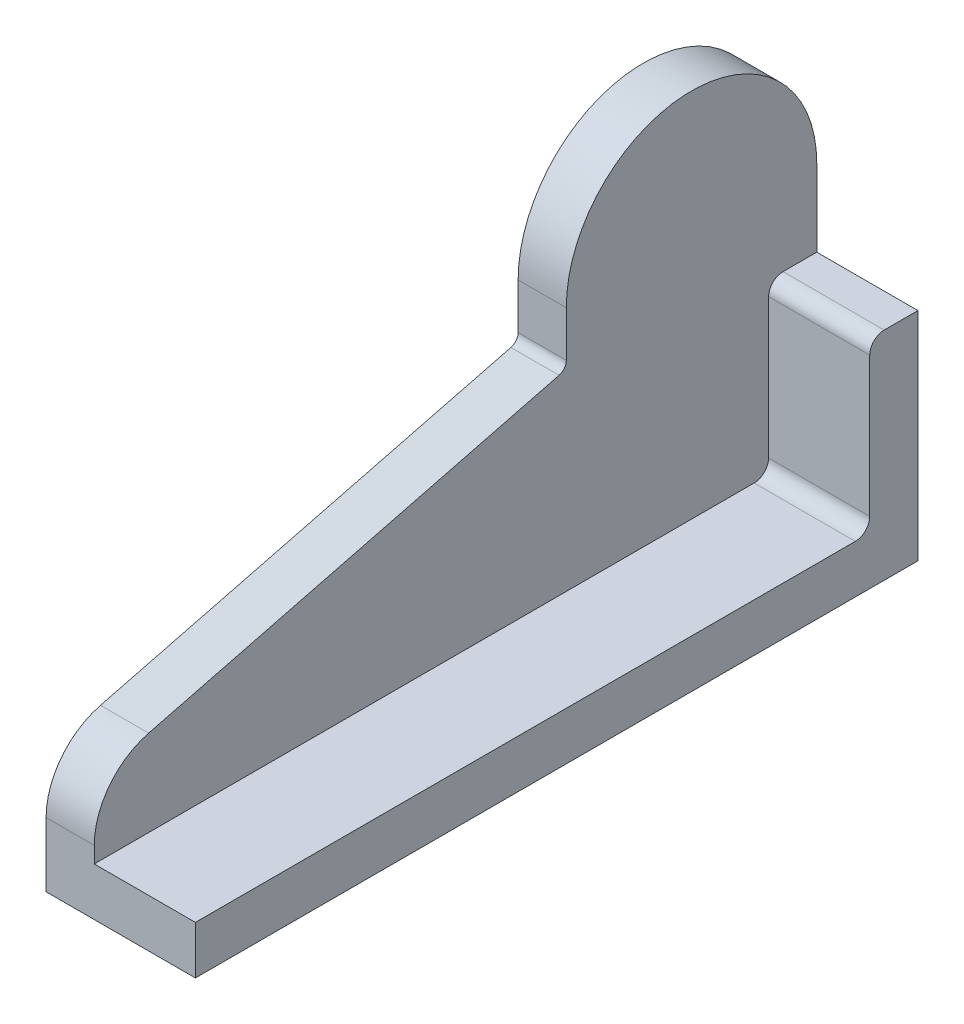
ISO-10303-21;
HEADER;
FILE_DESCRIPTION(('STEP AP214'),'2;1');
FILE_NAME('part.step','',(''),(''),'','','');
FILE_SCHEMA(('AUTOMOTIVE_DESIGN { 1 0 10303 214 1 1 1 1 }'));
ENDSEC;
DATA;
#1=APPLICATION_CONTEXT('core data for automotive mechanical design processes');
#2=APPLICATION_PROTOCOL_DEFINITION('international standard','automotive_design',2000,#1);
#3=PRODUCT_CONTEXT('',#1,'mechanical');
#4=PRODUCT('Part','Part','',(#3));
#5=PRODUCT_RELATED_PRODUCT_CATEGORY('part','',(#4));
#6=PRODUCT_DEFINITION_FORMATION('','',#4);
#7=PRODUCT_DEFINITION_CONTEXT('part definition',#1,'design');
#8=PRODUCT_DEFINITION('design','',#6,#7);
#9=PRODUCT_DEFINITION_SHAPE('','',#8);
#10=(LENGTH_UNIT() NAMED_UNIT(*) SI_UNIT(.MILLI.,.METRE.));
#11=(NAMED_UNIT(*) PLANE_ANGLE_UNIT() SI_UNIT($,.RADIAN.));
#12=(NAMED_UNIT(*) SI_UNIT($,.STERADIAN.) SOLID_ANGLE_UNIT());
#13=UNCERTAINTY_MEASURE_WITH_UNIT(LENGTH_MEASURE(1.E-05),#10,'distance_accuracy_value','');
#14=(GEOMETRIC_REPRESENTATION_CONTEXT(3) GLOBAL_UNCERTAINTY_ASSIGNED_CONTEXT((#13)) GLOBAL_UNIT_ASSIGNED_CONTEXT((#10,
#11,#12)) REPRESENTATION_CONTEXT('',''));
#15=CARTESIAN_POINT('',(0.,0.,0.));
#16=DIRECTION('',(0.,0.,1.));
#17=DIRECTION('',(1.,0.,0.));
#18=AXIS2_PLACEMENT_3D('',#15,#16,#17);
#19=CARTESIAN_POINT('',(-41.,10.,-75.));
#20=DIRECTION('',(0.,0.,1.));
#21=DIRECTION('',(1.,0.,0.));
#22=AXIS2_PLACEMENT_3D('',#19,#20,#21);
#23=PLANE('',#22);
#24=DIRECTION('',(-1.,0.,0.));
#25=VECTOR('',#24,1.);
#26=CARTESIAN_POINT('',(-41.,0.,-75.));
#27=LINE('',#26,#25);
#28=CARTESIAN_POINT('',(41.,0.,-75.));
#29=VERTEX_POINT('',#28);
#30=CARTESIAN_POINT('',(10.,0.,-75.));
#31=VERTEX_POINT('',#30);
#32=EDGE_CURVE('E169',#29,#31,#27,.T.);
#33=ORIENTED_EDGE('',*,*,#32,.T.);
#34=DIRECTION('',(0.,-1.,0.));
#35=VECTOR('',#34,1.);
#36=CARTESIAN_POINT('',(10.,45.,-75.));
#37=LINE('',#36,#35);
#38=CARTESIAN_POINT('',(10.,61.,-75.));
#39=VERTEX_POINT('',#38);
#40=EDGE_CURVE('E159',#39,#31,#37,.T.);
#41=ORIENTED_EDGE('',*,*,#40,.F.);
#42=DIRECTION('',(1.,0.,0.));
#43=VECTOR('',#42,1.);
#44=CARTESIAN_POINT('',(20.,61.,-75.));
#45=LINE('',#44,#43);
#46=CARTESIAN_POINT('',(20.,61.,-75.));
#47=VERTEX_POINT('',#46);
#48=EDGE_CURVE('E187',#39,#47,#45,.T.);
#49=ORIENTED_EDGE('',*,*,#48,.T.);
#50=DIRECTION('',(0.,1.,0.));
#51=VECTOR('',#50,1.);
#52=CARTESIAN_POINT('',(20.,45.,-75.));
#53=LINE('',#52,#51);
#54=CARTESIAN_POINT('',(20.,45.,-75.));
#55=VERTEX_POINT('',#54);
#56=EDGE_CURVE('E238',#55,#47,#53,.T.);
#57=ORIENTED_EDGE('',*,*,#56,.F.);
#58=DIRECTION('',(1.,0.,0.));
#59=VECTOR('',#58,1.);
#60=CARTESIAN_POINT('',(-41.,45.,-75.));
#61=LINE('',#60,#59);
#62=CARTESIAN_POINT('',(41.,45.,-75.));
#63=VERTEX_POINT('',#62);
#64=EDGE_CURVE('E254',#55,#63,#61,.T.);
#65=ORIENTED_EDGE('',*,*,#64,.T.);
#66=DIRECTION('',(0.,-1.,0.));
#67=VECTOR('',#66,1.);
#68=CARTESIAN_POINT('',(41.,10.,-75.));
#69=LINE('',#68,#67);
#70=EDGE_CURVE('E179',#63,#29,#69,.T.);
#71=ORIENTED_EDGE('',*,*,#70,.T.);
#72=EDGE_LOOP('',(#33,#41,#49,#57,#65,#71));
#73=FACE_BOUND('',#72,.T.);
#74=ADVANCED_FACE('F41',(#73),#23,.F.);
#75=CARTESIAN_POINT('',(-41.,10.,75.));
#76=DIRECTION('',(0.,0.,-1.));
#77=DIRECTION('',(-1.,0.,0.));
#78=AXIS2_PLACEMENT_3D('',#75,#76,#77);
#79=PLANE('',#78);
#80=DIRECTION('',(0.,-1.,0.));
#81=VECTOR('',#80,1.);
#82=CARTESIAN_POINT('',(10.,25.,75.));
#83=LINE('',#82,#81);
#84=CARTESIAN_POINT('',(10.,13.3461450703261,75.));
#85=VERTEX_POINT('',#84);
#86=CARTESIAN_POINT('',(10.,0.,75.));
#87=VERTEX_POINT('',#86);
#88=EDGE_CURVE('E139',#85,#87,#83,.T.);
#89=ORIENTED_EDGE('',*,*,#88,.T.);
#90=DIRECTION('',(1.,0.,0.));
#91=VECTOR('',#90,1.);
#92=CARTESIAN_POINT('',(-41.,0.,75.));
#93=LINE('',#92,#91);
#94=CARTESIAN_POINT('',(41.,0.,75.));
#95=VERTEX_POINT('',#94);
#96=EDGE_CURVE('E144',#87,#95,#93,.T.);
#97=ORIENTED_EDGE('',*,*,#96,.T.);
#98=DIRECTION('',(0.,-1.,0.));
#99=VECTOR('',#98,1.);
#100=CARTESIAN_POINT('',(41.,10.,75.));
#101=LINE('',#100,#99);
#102=CARTESIAN_POINT('',(41.,10.,75.));
#103=VERTEX_POINT('',#102);
#104=EDGE_CURVE('E177',#103,#95,#101,.T.);
#105=ORIENTED_EDGE('',*,*,#104,.F.);
#106=DIRECTION('',(1.,0.,0.));
#107=VECTOR('',#106,1.);
#108=CARTESIAN_POINT('',(-41.,10.,75.));
#109=LINE('',#108,#107);
#110=CARTESIAN_POINT('',(20.,10.,75.));
#111=VERTEX_POINT('',#110);
#112=EDGE_CURVE('E172',#111,#103,#109,.T.);
#113=ORIENTED_EDGE('',*,*,#112,.F.);
#114=DIRECTION('',(0.,-1.,0.));
#115=VECTOR('',#114,1.);
#116=CARTESIAN_POINT('',(20.,25.,75.));
#117=LINE('',#116,#115);
#118=CARTESIAN_POINT('',(20.,13.3461450703262,75.));
#119=VERTEX_POINT('',#118);
#120=EDGE_CURVE('E285',#119,#111,#117,.T.);
#121=ORIENTED_EDGE('',*,*,#120,.F.);
#122=DIRECTION('',(1.,0.,0.));
#123=VECTOR('',#122,1.);
#124=CARTESIAN_POINT('',(10.,13.3461450703261,75.));
#125=LINE('',#124,#123);
#126=EDGE_CURVE('E148',#119,#85,#125,.F.);
#127=ORIENTED_EDGE('',*,*,#126,.T.);
#128=EDGE_LOOP('',(#89,#97,#105,#113,#121,#127));
#129=FACE_BOUND('',#128,.T.);
#130=ADVANCED_FACE('F141',(#129),#79,.F.);
#131=CARTESIAN_POINT('',(0.,0.,0.));
#132=DIRECTION('',(0.,-1.,0.));
#133=DIRECTION('',(0.,0.,-1.));
#134=AXIS2_PLACEMENT_3D('',#131,#132,#133);
#135=PLANE('',#134);
#136=ORIENTED_EDGE('',*,*,#96,.F.);
#137=DIRECTION('',(0.,0.,-1.));
#138=VECTOR('',#137,1.);
#139=CARTESIAN_POINT('',(10.,0.,0.));
#140=LINE('',#139,#138);
#141=EDGE_CURVE('E156',#87,#31,#140,.T.);
#142=ORIENTED_EDGE('',*,*,#141,.T.);
#143=ORIENTED_EDGE('',*,*,#32,.F.);
#144=DIRECTION('',(0.,0.,-1.));
#145=VECTOR('',#144,1.);
#146=CARTESIAN_POINT('',(41.,0.,75.));
#147=LINE('',#146,#145);
#148=EDGE_CURVE('E167',#95,#29,#147,.T.);
#149=ORIENTED_EDGE('',*,*,#148,.F.);
#150=EDGE_LOOP('',(#136,#142,#143,#149));
#151=FACE_BOUND('',#150,.T.);
#152=ADVANCED_FACE('F166',(#151),#135,.T.);
#153=CARTESIAN_POINT('',(20.,61.,-49.));
#154=DIRECTION('',(-1.,0.,0.));
#155=DIRECTION('',(0.,0.,1.));
#156=AXIS2_PLACEMENT_3D('',#153,#154,#155);
#157=CYLINDRICAL_SURFACE('',#156,26.);
#158=DIRECTION('',(1.,0.,0.));
#159=VECTOR('',#158,1.);
#160=CARTESIAN_POINT('',(20.,61.,-23.));
#161=LINE('',#160,#159);
#162=CARTESIAN_POINT('',(20.,61.,-23.));
#163=VERTEX_POINT('',#162);
#164=CARTESIAN_POINT('',(10.,61.,-23.));
#165=VERTEX_POINT('',#164);
#166=EDGE_CURVE('E184',#163,#165,#161,.F.);
#167=ORIENTED_EDGE('',*,*,#166,.F.);
#168=CARTESIAN_POINT('',(20.,61.,-49.));
#169=DIRECTION('',(1.,0.,0.));
#170=DIRECTION('',(0.,0.,-1.));
#171=AXIS2_PLACEMENT_3D('',#168,#169,#170);
#172=CIRCLE('',#171,26.);
#173=EDGE_CURVE('E190',#47,#163,#172,.T.);
#174=ORIENTED_EDGE('',*,*,#173,.F.);
#175=ORIENTED_EDGE('',*,*,#48,.F.);
#176=CARTESIAN_POINT('',(10.,61.,-49.));
#177=DIRECTION('',(-1.,0.,0.));
#178=DIRECTION('',(0.,-1.,0.));
#179=AXIS2_PLACEMENT_3D('',#176,#177,#178);
#180=CIRCLE('',#179,26.);
#181=EDGE_CURVE('E193',#165,#39,#180,.T.);
#182=ORIENTED_EDGE('',*,*,#181,.F.);
#183=EDGE_LOOP('',(#167,#174,#175,#182));
#184=FACE_BOUND('',#183,.T.);
#185=ADVANCED_FACE('F307',(#184),#157,.T.);
#186=CARTESIAN_POINT('',(-41.,0.,-65.));
#187=DIRECTION('',(0.,0.,1.));
#188=DIRECTION('',(1.,0.,0.));
#189=AXIS2_PLACEMENT_3D('',#186,#187,#188);
#190=PLANE('',#189);
#191=DIRECTION('',(0.,1.,0.));
#192=VECTOR('',#191,1.);
#193=CARTESIAN_POINT('',(20.,0.,-65.));
#194=LINE('',#193,#192);
#195=CARTESIAN_POINT('',(20.,13.,-65.));
#196=VERTEX_POINT('',#195);
#197=CARTESIAN_POINT('',(20.,42.,-65.));
#198=VERTEX_POINT('',#197);
#199=EDGE_CURVE('E246',#196,#198,#194,.T.);
#200=ORIENTED_EDGE('',*,*,#199,.F.);
#201=DIRECTION('',(-1.,0.,0.));
#202=VECTOR('',#201,1.);
#203=CARTESIAN_POINT('',(-41.,13.,-65.));
#204=LINE('',#203,#202);
#205=CARTESIAN_POINT('',(41.,13.,-65.));
#206=VERTEX_POINT('',#205);
#207=EDGE_CURVE('E218',#196,#206,#204,.F.);
#208=ORIENTED_EDGE('',*,*,#207,.T.);
#209=DIRECTION('',(0.,-1.,0.));
#210=VECTOR('',#209,1.);
#211=CARTESIAN_POINT('',(41.,0.,-65.));
#212=LINE('',#211,#210);
#213=CARTESIAN_POINT('',(41.,42.,-65.));
#214=VERTEX_POINT('',#213);
#215=EDGE_CURVE('E251',#214,#206,#212,.T.);
#216=ORIENTED_EDGE('',*,*,#215,.F.);
#217=DIRECTION('',(1.,0.,0.));
#218=VECTOR('',#217,1.);
#219=CARTESIAN_POINT('',(-41.,42.,-65.));
#220=LINE('',#219,#218);
#221=EDGE_CURVE('E208',#214,#198,#220,.F.);
#222=ORIENTED_EDGE('',*,*,#221,.T.);
#223=EDGE_LOOP('',(#200,#208,#216,#222));
#224=FACE_BOUND('',#223,.T.);
#225=ADVANCED_FACE('F274',(#224),#190,.T.);
#226=CARTESIAN_POINT('',(-41.,45.,-75.));
#227=DIRECTION('',(0.,1.,0.));
#228=DIRECTION('',(0.,0.,1.));
#229=AXIS2_PLACEMENT_3D('',#226,#227,#228);
#230=PLANE('',#229);
#231=DIRECTION('',(0.,0.,-1.));
#232=VECTOR('',#231,1.);
#233=CARTESIAN_POINT('',(20.,45.,-75.));
#234=LINE('',#233,#232);
#235=CARTESIAN_POINT('',(20.,45.,-68.));
#236=VERTEX_POINT('',#235);
#237=EDGE_CURVE('E182',#236,#55,#234,.T.);
#238=ORIENTED_EDGE('',*,*,#237,.F.);
#239=DIRECTION('',(1.,0.,0.));
#240=VECTOR('',#239,1.);
#241=CARTESIAN_POINT('',(-41.,45.,-68.));
#242=LINE('',#241,#240);
#243=CARTESIAN_POINT('',(41.,45.,-68.));
#244=VERTEX_POINT('',#243);
#245=EDGE_CURVE('E203',#236,#244,#242,.T.);
#246=ORIENTED_EDGE('',*,*,#245,.T.);
#247=DIRECTION('',(0.,0.,1.));
#248=VECTOR('',#247,1.);
#249=CARTESIAN_POINT('',(41.,45.,-75.));
#250=LINE('',#249,#248);
#251=EDGE_CURVE('E248',#63,#244,#250,.T.);
#252=ORIENTED_EDGE('',*,*,#251,.F.);
#253=ORIENTED_EDGE('',*,*,#64,.F.);
#254=EDGE_LOOP('',(#238,#246,#252,#253));
#255=FACE_BOUND('',#254,.T.);
#256=ADVANCED_FACE('F266',(#255),#230,.T.);
#257=CARTESIAN_POINT('',(41.,10.,75.));
#258=DIRECTION('',(-1.,0.,0.));
#259=DIRECTION('',(0.,0.,1.));
#260=AXIS2_PLACEMENT_3D('',#257,#258,#259);
#261=PLANE('',#260);
#262=ORIENTED_EDGE('',*,*,#251,.T.);
#263=CARTESIAN_POINT('',(41.,42.,-68.));
#264=DIRECTION('',(-1.,0.,0.));
#265=DIRECTION('',(0.,0.,1.));
#266=AXIS2_PLACEMENT_3D('',#263,#264,#265);
#267=CIRCLE('',#266,3.);
#268=EDGE_CURVE('E206',#244,#214,#267,.F.);
#269=ORIENTED_EDGE('',*,*,#268,.T.);
#270=ORIENTED_EDGE('',*,*,#215,.T.);
#271=CARTESIAN_POINT('',(41.,13.,-62.));
#272=DIRECTION('',(-1.,0.,0.));
#273=DIRECTION('',(0.,0.,1.));
#274=AXIS2_PLACEMENT_3D('',#271,#272,#273);
#275=CIRCLE('',#274,3.);
#276=CARTESIAN_POINT('',(41.,10.,-62.));
#277=VERTEX_POINT('',#276);
#278=EDGE_CURVE('E220',#206,#277,#275,.T.);
#279=ORIENTED_EDGE('',*,*,#278,.T.);
#280=DIRECTION('',(0.,0.,-1.));
#281=VECTOR('',#280,1.);
#282=CARTESIAN_POINT('',(41.,10.,75.));
#283=LINE('',#282,#281);
#284=EDGE_CURVE('E168',#103,#277,#283,.T.);
#285=ORIENTED_EDGE('',*,*,#284,.F.);
#286=ORIENTED_EDGE('',*,*,#104,.T.);
#287=ORIENTED_EDGE('',*,*,#148,.T.);
#288=ORIENTED_EDGE('',*,*,#70,.F.);
#289=EDGE_LOOP('',(#262,#269,#270,#279,#285,#286,#287,#288));
#290=FACE_BOUND('',#289,.T.);
#291=ADVANCED_FACE('F258',(#290),#261,.F.);
#292=CARTESIAN_POINT('',(0.,10.,0.));
#293=DIRECTION('',(0.,-1.,0.));
#294=DIRECTION('',(0.,0.,-1.));
#295=AXIS2_PLACEMENT_3D('',#292,#293,#294);
#296=PLANE('',#295);
#297=ORIENTED_EDGE('',*,*,#284,.T.);
#298=DIRECTION('',(-1.,0.,0.));
#299=VECTOR('',#298,1.);
#300=CARTESIAN_POINT('',(0.,10.,-62.));
#301=LINE('',#300,#299);
#302=CARTESIAN_POINT('',(20.,10.,-62.));
#303=VERTEX_POINT('',#302);
#304=EDGE_CURVE('E213',#277,#303,#301,.T.);
#305=ORIENTED_EDGE('',*,*,#304,.T.);
#306=DIRECTION('',(0.,0.,1.));
#307=VECTOR('',#306,1.);
#308=CARTESIAN_POINT('',(20.,10.,-75.));
#309=LINE('',#308,#307);
#310=EDGE_CURVE('E244',#303,#111,#309,.T.);
#311=ORIENTED_EDGE('',*,*,#310,.T.);
#312=ORIENTED_EDGE('',*,*,#112,.T.);
#313=EDGE_LOOP('',(#297,#305,#311,#312));
#314=FACE_BOUND('',#313,.T.);
#315=ADVANCED_FACE('F283',(#314),#296,.F.);
#316=CARTESIAN_POINT('',(20.,45.,-75.));
#317=DIRECTION('',(1.,0.,0.));
#318=DIRECTION('',(0.,0.,-1.));
#319=AXIS2_PLACEMENT_3D('',#316,#317,#318);
#320=PLANE('',#319);
#321=ORIENTED_EDGE('',*,*,#120,.T.);
#322=ORIENTED_EDGE('',*,*,#310,.F.);
#323=CARTESIAN_POINT('',(20.,13.,-62.));
#324=DIRECTION('',(1.,0.,0.));
#325=DIRECTION('',(0.,0.,-1.));
#326=AXIS2_PLACEMENT_3D('',#323,#324,#325);
#327=CIRCLE('',#326,3.);
#328=EDGE_CURVE('E216',#303,#196,#327,.T.);
#329=ORIENTED_EDGE('',*,*,#328,.T.);
#330=ORIENTED_EDGE('',*,*,#199,.T.);
#331=CARTESIAN_POINT('',(20.,42.,-68.));
#332=DIRECTION('',(1.,0.,0.));
#333=DIRECTION('',(0.,0.,-1.));
#334=AXIS2_PLACEMENT_3D('',#331,#332,#333);
#335=CIRCLE('',#334,3.);
#336=EDGE_CURVE('E211',#198,#236,#335,.F.);
#337=ORIENTED_EDGE('',*,*,#336,.T.);
#338=ORIENTED_EDGE('',*,*,#237,.T.);
#339=ORIENTED_EDGE('',*,*,#56,.T.);
#340=ORIENTED_EDGE('',*,*,#173,.T.);
#341=DIRECTION('',(0.,1.,0.));
#342=VECTOR('',#341,1.);
#343=CARTESIAN_POINT('',(20.,45.,-23.));
#344=LINE('',#343,#342);
#345=CARTESIAN_POINT('',(20.,51.5538473239565,-23.));
#346=VERTEX_POINT('',#345);
#347=EDGE_CURVE('E229',#346,#163,#344,.T.);
#348=ORIENTED_EDGE('',*,*,#347,.F.);
#349=CARTESIAN_POINT('',(20.,51.5538473239565,-21.));
#350=DIRECTION('',(1.,0.,0.));
#351=DIRECTION('',(0.,0.,-1.));
#352=AXIS2_PLACEMENT_3D('',#349,#350,#351);
#353=CIRCLE('',#352,2.);
#354=CARTESIAN_POINT('',(20.,49.6159110937015,-21.4943714873099));
#355=VERTEX_POINT('',#354);
#356=EDGE_CURVE('E49',#346,#355,#353,.F.);
#357=ORIENTED_EDGE('',*,*,#356,.T.);
#358=DIRECTION('',(0.,-0.247185743654974,0.968968115127499));
#359=VECTOR('',#358,1.);
#360=CARTESIAN_POINT('',(20.,50.,-23.));
#361=LINE('',#360,#359);
#362=CARTESIAN_POINT('',(20.,27.8806667972386,63.7077861548246));
#363=VERTEX_POINT('',#362);
#364=EDGE_CURVE('E163',#355,#363,#361,.T.);
#365=ORIENTED_EDGE('',*,*,#364,.T.);
#366=CARTESIAN_POINT('',(20.,13.3461450703261,60.));
#367=DIRECTION('',(1.,0.,0.));
#368=DIRECTION('',(0.,0.,-1.));
#369=AXIS2_PLACEMENT_3D('',#366,#367,#368);
#370=CIRCLE('',#369,15.);
#371=EDGE_CURVE('E198',#363,#119,#370,.T.);
#372=ORIENTED_EDGE('',*,*,#371,.T.);
#373=EDGE_LOOP('',(#321,#322,#329,#330,#337,#338,#339,#340,#348,#357,#365,#372));
#374=FACE_BOUND('',#373,.T.);
#375=ADVANCED_FACE('F234',(#374),#320,.T.);
#376=CARTESIAN_POINT('',(10.,45.,-75.));
#377=DIRECTION('',(-1.,0.,0.));
#378=DIRECTION('',(0.,-1.,0.));
#379=AXIS2_PLACEMENT_3D('',#376,#377,#378);
#380=PLANE('',#379);
#381=ORIENTED_EDGE('',*,*,#141,.F.);
#382=ORIENTED_EDGE('',*,*,#88,.F.);
#383=CARTESIAN_POINT('',(10.,13.3461450703261,60.));
#384=DIRECTION('',(-1.,0.,0.));
#385=DIRECTION('',(0.,-1.,0.));
#386=AXIS2_PLACEMENT_3D('',#383,#384,#385);
#387=CIRCLE('',#386,15.);
#388=CARTESIAN_POINT('',(10.,27.8806667972386,63.7077861548246));
#389=VERTEX_POINT('',#388);
#390=EDGE_CURVE('E201',#85,#389,#387,.T.);
#391=ORIENTED_EDGE('',*,*,#390,.T.);
#392=DIRECTION('',(0.,-0.247185743654974,0.968968115127499));
#393=VECTOR('',#392,1.);
#394=CARTESIAN_POINT('',(10.,50.,-23.));
#395=LINE('',#394,#393);
#396=CARTESIAN_POINT('',(10.,49.6159110937015,-21.4943714873099));
#397=VERTEX_POINT('',#396);
#398=EDGE_CURVE('E153',#397,#389,#395,.T.);
#399=ORIENTED_EDGE('',*,*,#398,.F.);
#400=CARTESIAN_POINT('',(10.,51.5538473239565,-21.));
#401=DIRECTION('',(-1.,0.,0.));
#402=DIRECTION('',(0.,-1.,0.));
#403=AXIS2_PLACEMENT_3D('',#400,#401,#402);
#404=CIRCLE('',#403,2.);
#405=CARTESIAN_POINT('',(10.,51.5538473239565,-23.));
#406=VERTEX_POINT('',#405);
#407=EDGE_CURVE('E11',#397,#406,#404,.F.);
#408=ORIENTED_EDGE('',*,*,#407,.T.);
#409=DIRECTION('',(0.,-1.,0.));
#410=VECTOR('',#409,1.);
#411=CARTESIAN_POINT('',(10.,45.,-23.));
#412=LINE('',#411,#410);
#413=EDGE_CURVE('E152',#165,#406,#412,.T.);
#414=ORIENTED_EDGE('',*,*,#413,.F.);
#415=ORIENTED_EDGE('',*,*,#181,.T.);
#416=ORIENTED_EDGE('',*,*,#40,.T.);
#417=EDGE_LOOP('',(#381,#382,#391,#399,#408,#414,#415,#416));
#418=FACE_BOUND('',#417,.T.);
#419=ADVANCED_FACE('F157',(#418),#380,.T.);
#420=CARTESIAN_POINT('',(0.,0.,-23.));
#421=DIRECTION('',(0.,0.,-1.));
#422=DIRECTION('',(-1.,0.,0.));
#423=AXIS2_PLACEMENT_3D('',#420,#421,#422);
#424=PLANE('',#423);
#425=ORIENTED_EDGE('',*,*,#413,.T.);
#426=DIRECTION('',(1.,0.,0.));
#427=VECTOR('',#426,1.);
#428=CARTESIAN_POINT('',(0.,51.5538473239565,-23.));
#429=LINE('',#428,#427);
#430=EDGE_CURVE('E222',#406,#346,#429,.T.);
#431=ORIENTED_EDGE('',*,*,#430,.T.);
#432=ORIENTED_EDGE('',*,*,#347,.T.);
#433=ORIENTED_EDGE('',*,*,#166,.T.);
#434=EDGE_LOOP('',(#425,#431,#432,#433));
#435=FACE_BOUND('',#434,.T.);
#436=ADVANCED_FACE('F228',(#435),#424,.F.);
#437=CARTESIAN_POINT('',(-95.8489489791939,50.,-23.));
#438=DIRECTION('',(0.,0.968968115127499,0.247185743654974));
#439=DIRECTION('',(0.,-0.247185743654974,0.968968115127499));
#440=AXIS2_PLACEMENT_3D('',#437,#438,#439);
#441=PLANE('',#440);
#442=ORIENTED_EDGE('',*,*,#364,.F.);
#443=DIRECTION('',(1.,0.,0.));
#444=VECTOR('',#443,1.);
#445=CARTESIAN_POINT('',(-95.8489489791939,49.6159110937015,-21.4943714873099));
#446=LINE('',#445,#444);
#447=EDGE_CURVE('E62',#355,#397,#446,.F.);
#448=ORIENTED_EDGE('',*,*,#447,.T.);
#449=ORIENTED_EDGE('',*,*,#398,.T.);
#450=DIRECTION('',(1.,0.,0.));
#451=VECTOR('',#450,1.);
#452=CARTESIAN_POINT('',(20.,27.8806667972386,63.7077861548246));
#453=LINE('',#452,#451);
#454=EDGE_CURVE('E195',#389,#363,#453,.T.);
#455=ORIENTED_EDGE('',*,*,#454,.T.);
#456=EDGE_LOOP('',(#442,#448,#449,#455));
#457=FACE_BOUND('',#456,.T.);
#458=ADVANCED_FACE('F315',(#457),#441,.T.);
#459=CARTESIAN_POINT('',(-95.8489489791939,13.3461450703261,60.));
#460=DIRECTION('',(-1.,0.,0.));
#461=DIRECTION('',(0.,0.,1.));
#462=AXIS2_PLACEMENT_3D('',#459,#460,#461);
#463=CYLINDRICAL_SURFACE('',#462,15.);
#464=ORIENTED_EDGE('',*,*,#390,.F.);
#465=ORIENTED_EDGE('',*,*,#126,.F.);
#466=ORIENTED_EDGE('',*,*,#371,.F.);
#467=ORIENTED_EDGE('',*,*,#454,.F.);
#468=EDGE_LOOP('',(#464,#465,#466,#467));
#469=FACE_BOUND('',#468,.T.);
#470=ADVANCED_FACE('F289',(#469),#463,.T.);
#471=CARTESIAN_POINT('',(-41.,42.,-68.));
#472=DIRECTION('',(1.,0.,0.));
#473=DIRECTION('',(0.,0.,-1.));
#474=AXIS2_PLACEMENT_3D('',#471,#472,#473);
#475=CYLINDRICAL_SURFACE('',#474,3.);
#476=ORIENTED_EDGE('',*,*,#336,.F.);
#477=ORIENTED_EDGE('',*,*,#221,.F.);
#478=ORIENTED_EDGE('',*,*,#268,.F.);
#479=ORIENTED_EDGE('',*,*,#245,.F.);
#480=EDGE_LOOP('',(#476,#477,#478,#479));
#481=FACE_BOUND('',#480,.T.);
#482=ADVANCED_FACE('F277',(#481),#475,.T.);
#483=CARTESIAN_POINT('',(0.,13.,-62.));
#484=DIRECTION('',(-1.,0.,0.));
#485=DIRECTION('',(0.,0.,1.));
#486=AXIS2_PLACEMENT_3D('',#483,#484,#485);
#487=CYLINDRICAL_SURFACE('',#486,3.);
#488=ORIENTED_EDGE('',*,*,#278,.F.);
#489=ORIENTED_EDGE('',*,*,#207,.F.);
#490=ORIENTED_EDGE('',*,*,#328,.F.);
#491=ORIENTED_EDGE('',*,*,#304,.F.);
#492=EDGE_LOOP('',(#488,#489,#490,#491));
#493=FACE_BOUND('',#492,.T.);
#494=ADVANCED_FACE('F280',(#493),#487,.F.);
#495=CARTESIAN_POINT('',(0.,51.5538473239565,-21.));
#496=DIRECTION('',(1.,0.,0.));
#497=DIRECTION('',(0.,0.,-1.));
#498=AXIS2_PLACEMENT_3D('',#495,#496,#497);
#499=CYLINDRICAL_SURFACE('',#498,2.);
#500=ORIENTED_EDGE('',*,*,#407,.F.);
#501=ORIENTED_EDGE('',*,*,#447,.F.);
#502=ORIENTED_EDGE('',*,*,#356,.F.);
#503=ORIENTED_EDGE('',*,*,#430,.F.);
#504=EDGE_LOOP('',(#500,#501,#502,#503));
#505=FACE_BOUND('',#504,.T.);
#506=ADVANCED_FACE('F43',(#505),#499,.F.);
#507=CLOSED_SHELL('',(#74,#130,#152,#185,#225,#256,#291,#315,#375,#419,#436,#458,#470,#482,#494,#506));
#508=MANIFOLD_SOLID_BREP('B2',#507);
#509=ADVANCED_BREP_SHAPE_REPRESENTATION('',(#18,#508),#14);
#510=SHAPE_DEFINITION_REPRESENTATION(#9,#509);
ENDSEC;
END-ISO-10303-21;
